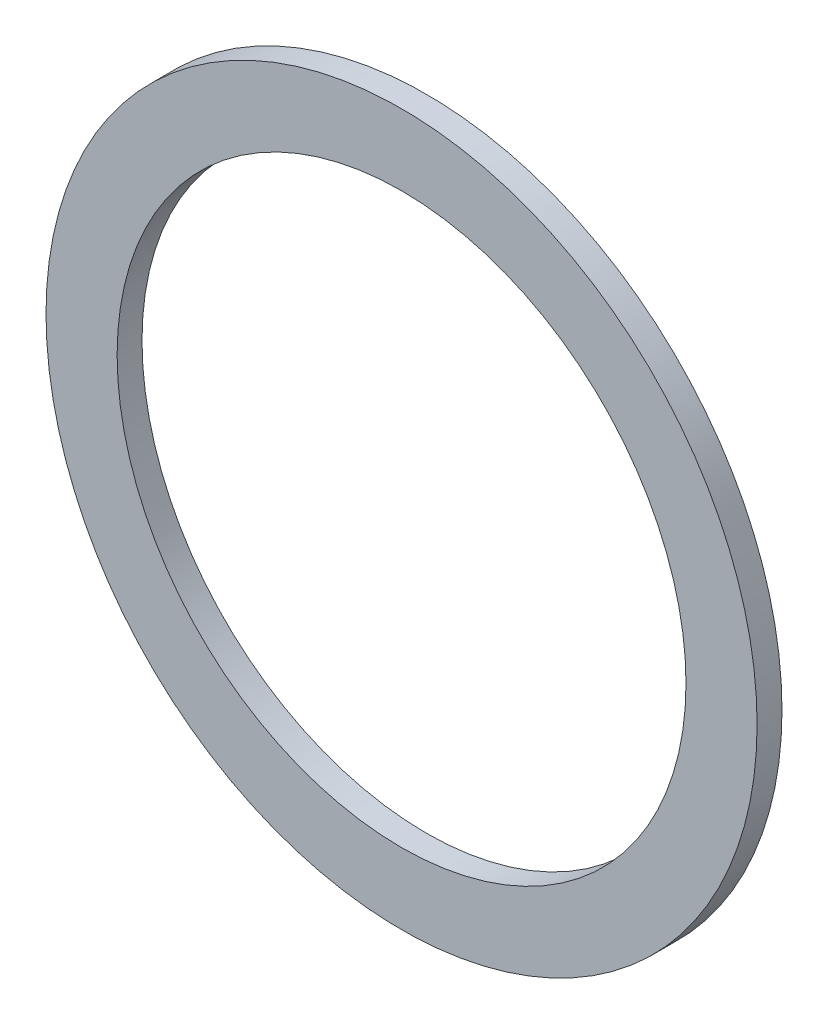
ISO-10303-21;
HEADER;
FILE_DESCRIPTION(('STEP AP214'),'2;1');
FILE_NAME('part.step','',(''),(''),'','','');
FILE_SCHEMA(('AUTOMOTIVE_DESIGN { 1 0 10303 214 1 1 1 1 }'));
ENDSEC;
DATA;
#1=APPLICATION_CONTEXT('core data for automotive mechanical design processes');
#2=APPLICATION_PROTOCOL_DEFINITION('international standard','automotive_design',2000,#1);
#3=PRODUCT_CONTEXT('',#1,'mechanical');
#4=PRODUCT('Part','Part','',(#3));
#5=PRODUCT_RELATED_PRODUCT_CATEGORY('part','',(#4));
#6=PRODUCT_DEFINITION_FORMATION('','',#4);
#7=PRODUCT_DEFINITION_CONTEXT('part definition',#1,'design');
#8=PRODUCT_DEFINITION('design','',#6,#7);
#9=PRODUCT_DEFINITION_SHAPE('','',#8);
#10=(LENGTH_UNIT() NAMED_UNIT(*) SI_UNIT(.MILLI.,.METRE.));
#11=(NAMED_UNIT(*) PLANE_ANGLE_UNIT() SI_UNIT($,.RADIAN.));
#12=(NAMED_UNIT(*) SI_UNIT($,.STERADIAN.) SOLID_ANGLE_UNIT());
#13=UNCERTAINTY_MEASURE_WITH_UNIT(LENGTH_MEASURE(1.E-05),#10,'distance_accuracy_value','');
#14=(GEOMETRIC_REPRESENTATION_CONTEXT(3) GLOBAL_UNCERTAINTY_ASSIGNED_CONTEXT((#13)) GLOBAL_UNIT_ASSIGNED_CONTEXT((#10,
#11,#12)) REPRESENTATION_CONTEXT('',''));
#15=CARTESIAN_POINT('',(0.,0.,0.));
#16=DIRECTION('',(0.,0.,1.));
#17=DIRECTION('',(1.,0.,0.));
#18=AXIS2_PLACEMENT_3D('',#15,#16,#17);
#19=CARTESIAN_POINT('',(0.,0.,7.));
#20=DIRECTION('',(0.,0.,1.));
#21=DIRECTION('',(1.,0.,0.));
#22=AXIS2_PLACEMENT_3D('',#19,#20,#21);
#23=PLANE('',#22);
#24=CARTESIAN_POINT('',(0.,0.,7.));
#25=DIRECTION('',(0.,0.,1.));
#26=DIRECTION('',(1.,0.,0.));
#27=AXIS2_PLACEMENT_3D('',#24,#25,#26);
#28=CIRCLE('',#27,100.);
#29=CARTESIAN_POINT('',(100.,0.,7.));
#30=VERTEX_POINT('',#29);
#31=EDGE_CURVE('E10',#30,#30,#28,.T.);
#32=ORIENTED_EDGE('',*,*,#31,.T.);
#33=EDGE_LOOP('',(#32));
#34=FACE_BOUND('',#33,.T.);
#35=CARTESIAN_POINT('',(0.,0.,7.));
#36=DIRECTION('',(0.,0.,1.));
#37=DIRECTION('',(1.,0.,0.));
#38=AXIS2_PLACEMENT_3D('',#35,#36,#37);
#39=CIRCLE('',#38,80.);
#40=CARTESIAN_POINT('',(80.,0.,7.));
#41=VERTEX_POINT('',#40);
#42=EDGE_CURVE('E48',#41,#41,#39,.T.);
#43=ORIENTED_EDGE('',*,*,#42,.F.);
#44=EDGE_LOOP('',(#43));
#45=FACE_BOUND('',#44,.T.);
#46=ADVANCED_FACE('F37',(#34,#45),#23,.T.);
#47=CARTESIAN_POINT('',(0.,0.,0.));
#48=DIRECTION('',(0.,0.,1.));
#49=DIRECTION('',(1.,0.,0.));
#50=AXIS2_PLACEMENT_3D('',#47,#48,#49);
#51=PLANE('',#50);
#52=CARTESIAN_POINT('',(0.,0.,0.));
#53=DIRECTION('',(0.,0.,1.));
#54=DIRECTION('',(1.,0.,0.));
#55=AXIS2_PLACEMENT_3D('',#52,#53,#54);
#56=CIRCLE('',#55,100.);
#57=CARTESIAN_POINT('',(100.,0.,0.));
#58=VERTEX_POINT('',#57);
#59=EDGE_CURVE('E41',#58,#58,#56,.T.);
#60=ORIENTED_EDGE('',*,*,#59,.F.);
#61=EDGE_LOOP('',(#60));
#62=FACE_BOUND('',#61,.T.);
#63=CARTESIAN_POINT('',(0.,0.,0.));
#64=DIRECTION('',(0.,0.,1.));
#65=DIRECTION('',(1.,0.,0.));
#66=AXIS2_PLACEMENT_3D('',#63,#64,#65);
#67=CIRCLE('',#66,80.);
#68=CARTESIAN_POINT('',(80.,0.,0.));
#69=VERTEX_POINT('',#68);
#70=EDGE_CURVE('E50',#69,#69,#67,.T.);
#71=ORIENTED_EDGE('',*,*,#70,.T.);
#72=EDGE_LOOP('',(#71));
#73=FACE_BOUND('',#72,.T.);
#74=ADVANCED_FACE('F60',(#62,#73),#51,.F.);
#75=CARTESIAN_POINT('',(0.,0.,7.));
#76=DIRECTION('',(0.,0.,-1.));
#77=DIRECTION('',(-1.,0.,0.));
#78=AXIS2_PLACEMENT_3D('',#75,#76,#77);
#79=CYLINDRICAL_SURFACE('',#78,100.);
#80=ORIENTED_EDGE('',*,*,#31,.F.);
#81=EDGE_LOOP('',(#80));
#82=FACE_BOUND('',#81,.T.);
#83=ORIENTED_EDGE('',*,*,#59,.T.);
#84=EDGE_LOOP('',(#83));
#85=FACE_BOUND('',#84,.T.);
#86=ADVANCED_FACE('F39',(#82,#85),#79,.T.);
#87=CARTESIAN_POINT('',(0.,0.,7.));
#88=DIRECTION('',(0.,0.,-1.));
#89=DIRECTION('',(-1.,0.,0.));
#90=AXIS2_PLACEMENT_3D('',#87,#88,#89);
#91=CYLINDRICAL_SURFACE('',#90,80.);
#92=ORIENTED_EDGE('',*,*,#42,.T.);
#93=EDGE_LOOP('',(#92));
#94=FACE_BOUND('',#93,.T.);
#95=ORIENTED_EDGE('',*,*,#70,.F.);
#96=EDGE_LOOP('',(#95));
#97=FACE_BOUND('',#96,.T.);
#98=ADVANCED_FACE('F56',(#94,#97),#91,.F.);
#99=CLOSED_SHELL('',(#46,#74,#86,#98));
#100=MANIFOLD_SOLID_BREP('B2',#99);
#101=ADVANCED_BREP_SHAPE_REPRESENTATION('',(#18,#100),#14);
#102=SHAPE_DEFINITION_REPRESENTATION(#9,#101);
ENDSEC;
END-ISO-10303-21;
